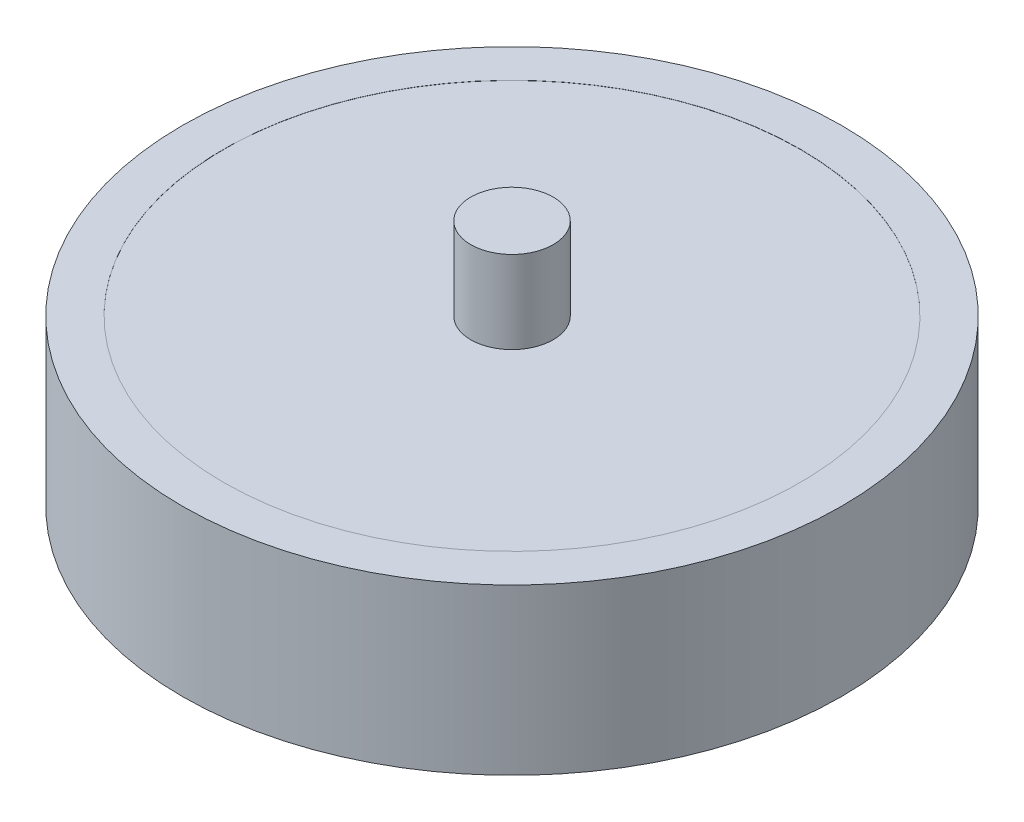
ISO-10303-21;
HEADER;
FILE_DESCRIPTION(('STEP AP214'),'2;1');
FILE_NAME('part.step','',(''),(''),'','','');
FILE_SCHEMA(('AUTOMOTIVE_DESIGN { 1 0 10303 214 1 1 1 1 }'));
ENDSEC;
DATA;
#1=APPLICATION_CONTEXT('core data for automotive mechanical design processes');
#2=APPLICATION_PROTOCOL_DEFINITION('international standard','automotive_design',2000,#1);
#3=PRODUCT_CONTEXT('',#1,'mechanical');
#4=PRODUCT('Part','Part','',(#3));
#5=PRODUCT_RELATED_PRODUCT_CATEGORY('part','',(#4));
#6=PRODUCT_DEFINITION_FORMATION('','',#4);
#7=PRODUCT_DEFINITION_CONTEXT('part definition',#1,'design');
#8=PRODUCT_DEFINITION('design','',#6,#7);
#9=PRODUCT_DEFINITION_SHAPE('','',#8);
#10=(LENGTH_UNIT() NAMED_UNIT(*) SI_UNIT(.MILLI.,.METRE.));
#11=(NAMED_UNIT(*) PLANE_ANGLE_UNIT() SI_UNIT($,.RADIAN.));
#12=(NAMED_UNIT(*) SI_UNIT($,.STERADIAN.) SOLID_ANGLE_UNIT());
#13=UNCERTAINTY_MEASURE_WITH_UNIT(LENGTH_MEASURE(1.E-05),#10,'distance_accuracy_value','');
#14=(GEOMETRIC_REPRESENTATION_CONTEXT(3) GLOBAL_UNCERTAINTY_ASSIGNED_CONTEXT((#13)) GLOBAL_UNIT_ASSIGNED_CONTEXT((#10,
#11,#12)) REPRESENTATION_CONTEXT('',''));
#15=CARTESIAN_POINT('',(0.,0.,0.));
#16=DIRECTION('',(0.,0.,1.));
#17=DIRECTION('',(1.,0.,0.));
#18=AXIS2_PLACEMENT_3D('',#15,#16,#17);
#19=CARTESIAN_POINT('',(0.,10.,0.));
#20=DIRECTION('',(0.,1.,0.));
#21=DIRECTION('',(0.,0.,1.));
#22=AXIS2_PLACEMENT_3D('',#19,#20,#21);
#23=PLANE('',#22);
#24=CARTESIAN_POINT('',(0.,10.,0.));
#25=DIRECTION('',(0.,1.,0.));
#26=DIRECTION('',(0.,0.,1.));
#27=AXIS2_PLACEMENT_3D('',#24,#25,#26);
#28=CIRCLE('',#27,20.);
#29=CARTESIAN_POINT('',(0.,10.,20.));
#30=VERTEX_POINT('',#29);
#31=EDGE_CURVE('E38',#30,#30,#28,.T.);
#32=ORIENTED_EDGE('',*,*,#31,.T.);
#33=EDGE_LOOP('',(#32));
#34=FACE_BOUND('',#33,.T.);
#35=CARTESIAN_POINT('',(0.,10.,0.));
#36=DIRECTION('',(0.,1.,0.));
#37=DIRECTION('',(0.,0.,1.));
#38=AXIS2_PLACEMENT_3D('',#35,#36,#37);
#39=CIRCLE('',#38,17.5);
#40=CARTESIAN_POINT('',(0.,10.,17.5));
#41=VERTEX_POINT('',#40);
#42=EDGE_CURVE('E47',#41,#41,#39,.T.);
#43=ORIENTED_EDGE('',*,*,#42,.F.);
#44=EDGE_LOOP('',(#43));
#45=FACE_BOUND('',#44,.T.);
#46=ADVANCED_FACE('F31',(#34,#45),#23,.T.);
#47=CARTESIAN_POINT('',(0.,0.,0.));
#48=DIRECTION('',(0.,1.,0.));
#49=DIRECTION('',(0.,0.,1.));
#50=AXIS2_PLACEMENT_3D('',#47,#48,#49);
#51=PLANE('',#50);
#52=CARTESIAN_POINT('',(0.,0.,0.));
#53=DIRECTION('',(0.,-1.,0.));
#54=DIRECTION('',(0.,0.,-1.));
#55=AXIS2_PLACEMENT_3D('',#52,#53,#54);
#56=CIRCLE('',#55,2.5);
#57=CARTESIAN_POINT('',(0.,0.,-2.5));
#58=VERTEX_POINT('',#57);
#59=EDGE_CURVE('E58',#58,#58,#56,.T.);
#60=ORIENTED_EDGE('',*,*,#59,.F.);
#61=EDGE_LOOP('',(#60));
#62=FACE_BOUND('',#61,.T.);
#63=CARTESIAN_POINT('',(0.,0.,0.));
#64=DIRECTION('',(0.,1.,0.));
#65=DIRECTION('',(0.,0.,1.));
#66=AXIS2_PLACEMENT_3D('',#63,#64,#65);
#67=CIRCLE('',#66,20.);
#68=CARTESIAN_POINT('',(0.,0.,20.));
#69=VERTEX_POINT('',#68);
#70=EDGE_CURVE('E42',#69,#69,#67,.T.);
#71=ORIENTED_EDGE('',*,*,#70,.F.);
#72=EDGE_LOOP('',(#71));
#73=FACE_BOUND('',#72,.T.);
#74=ADVANCED_FACE('F73',(#62,#73),#51,.F.);
#75=CARTESIAN_POINT('',(0.,10.,0.));
#76=DIRECTION('',(0.,-1.,0.));
#77=DIRECTION('',(0.,0.,-1.));
#78=AXIS2_PLACEMENT_3D('',#75,#76,#77);
#79=CYLINDRICAL_SURFACE('',#78,20.);
#80=ORIENTED_EDGE('',*,*,#31,.F.);
#81=EDGE_LOOP('',(#80));
#82=FACE_BOUND('',#81,.T.);
#83=ORIENTED_EDGE('',*,*,#70,.T.);
#84=EDGE_LOOP('',(#83));
#85=FACE_BOUND('',#84,.T.);
#86=ADVANCED_FACE('F33',(#82,#85),#79,.T.);
#87=CARTESIAN_POINT('',(0.,10.,0.));
#88=DIRECTION('',(0.,-1.,0.));
#89=DIRECTION('',(0.,0.,-1.));
#90=AXIS2_PLACEMENT_3D('',#87,#88,#89);
#91=CYLINDRICAL_SURFACE('',#90,17.5);
#92=CARTESIAN_POINT('',(0.,9.99,0.));
#93=DIRECTION('',(0.,1.,0.));
#94=DIRECTION('',(0.,0.,1.));
#95=AXIS2_PLACEMENT_3D('',#92,#93,#94);
#96=CIRCLE('',#95,17.5);
#97=CARTESIAN_POINT('',(0.,9.99,17.5));
#98=VERTEX_POINT('',#97);
#99=EDGE_CURVE('E10',#98,#98,#96,.T.);
#100=ORIENTED_EDGE('',*,*,#99,.F.);
#101=EDGE_LOOP('',(#100));
#102=FACE_BOUND('',#101,.T.);
#103=ORIENTED_EDGE('',*,*,#42,.T.);
#104=EDGE_LOOP('',(#103));
#105=FACE_BOUND('',#104,.T.);
#106=ADVANCED_FACE('F79',(#102,#105),#91,.F.);
#107=CARTESIAN_POINT('',(0.,9.99,0.));
#108=DIRECTION('',(0.,1.,0.));
#109=DIRECTION('',(0.,0.,1.));
#110=AXIS2_PLACEMENT_3D('',#107,#108,#109);
#111=PLANE('',#110);
#112=CARTESIAN_POINT('',(0.,9.99,0.));
#113=DIRECTION('',(0.,1.,0.));
#114=DIRECTION('',(0.,0.,1.));
#115=AXIS2_PLACEMENT_3D('',#112,#113,#114);
#116=CIRCLE('',#115,2.5);
#117=CARTESIAN_POINT('',(0.,9.99,2.5));
#118=VERTEX_POINT('',#117);
#119=EDGE_CURVE('E52',#118,#118,#116,.T.);
#120=ORIENTED_EDGE('',*,*,#119,.F.);
#121=EDGE_LOOP('',(#120));
#122=FACE_BOUND('',#121,.T.);
#123=ORIENTED_EDGE('',*,*,#99,.T.);
#124=EDGE_LOOP('',(#123));
#125=FACE_BOUND('',#124,.T.);
#126=ADVANCED_FACE('F84',(#122,#125),#111,.T.);
#127=CARTESIAN_POINT('',(0.,14.99,0.));
#128=DIRECTION('',(0.,-1.,0.));
#129=DIRECTION('',(0.,0.,-1.));
#130=AXIS2_PLACEMENT_3D('',#127,#128,#129);
#131=CYLINDRICAL_SURFACE('',#130,2.5);
#132=CARTESIAN_POINT('',(0.,14.99,0.));
#133=DIRECTION('',(0.,1.,0.));
#134=DIRECTION('',(0.,0.,1.));
#135=AXIS2_PLACEMENT_3D('',#132,#133,#134);
#136=CIRCLE('',#135,2.5);
#137=CARTESIAN_POINT('',(0.,14.99,2.5));
#138=VERTEX_POINT('',#137);
#139=EDGE_CURVE('E51',#138,#138,#136,.T.);
#140=ORIENTED_EDGE('',*,*,#139,.F.);
#141=EDGE_LOOP('',(#140));
#142=FACE_BOUND('',#141,.T.);
#143=ORIENTED_EDGE('',*,*,#119,.T.);
#144=EDGE_LOOP('',(#143));
#145=FACE_BOUND('',#144,.T.);
#146=ADVANCED_FACE('F95',(#142,#145),#131,.T.);
#147=CARTESIAN_POINT('',(0.,14.99,0.));
#148=DIRECTION('',(0.,1.,0.));
#149=DIRECTION('',(0.,0.,1.));
#150=AXIS2_PLACEMENT_3D('',#147,#148,#149);
#151=PLANE('',#150);
#152=ORIENTED_EDGE('',*,*,#139,.T.);
#153=EDGE_LOOP('',(#152));
#154=FACE_BOUND('',#153,.T.);
#155=ADVANCED_FACE('F69',(#154),#151,.T.);
#156=CARTESIAN_POINT('',(0.,5.,0.));
#157=DIRECTION('',(0.,-1.,0.));
#158=DIRECTION('',(0.,0.,-1.));
#159=AXIS2_PLACEMENT_3D('',#156,#157,#158);
#160=CYLINDRICAL_SURFACE('',#159,2.5);
#161=CARTESIAN_POINT('',(0.,5.,0.));
#162=DIRECTION('',(0.,-1.,0.));
#163=DIRECTION('',(0.,0.,-1.));
#164=AXIS2_PLACEMENT_3D('',#161,#162,#163);
#165=CIRCLE('',#164,2.5);
#166=CARTESIAN_POINT('',(0.,5.,-2.5));
#167=VERTEX_POINT('',#166);
#168=EDGE_CURVE('E55',#167,#167,#165,.T.);
#169=ORIENTED_EDGE('',*,*,#168,.F.);
#170=EDGE_LOOP('',(#169));
#171=FACE_BOUND('',#170,.T.);
#172=ORIENTED_EDGE('',*,*,#59,.T.);
#173=EDGE_LOOP('',(#172));
#174=FACE_BOUND('',#173,.T.);
#175=ADVANCED_FACE('F66',(#171,#174),#160,.F.);
#176=CARTESIAN_POINT('',(0.,5.,0.));
#177=DIRECTION('',(0.,-1.,0.));
#178=DIRECTION('',(0.,0.,-1.));
#179=AXIS2_PLACEMENT_3D('',#176,#177,#178);
#180=PLANE('',#179);
#181=ORIENTED_EDGE('',*,*,#168,.T.);
#182=EDGE_LOOP('',(#181));
#183=FACE_BOUND('',#182,.T.);
#184=ADVANCED_FACE('F64',(#183),#180,.T.);
#185=CLOSED_SHELL('',(#46,#74,#86,#106,#126,#146,#155,#175,#184));
#186=MANIFOLD_SOLID_BREP('B2',#185);
#187=ADVANCED_BREP_SHAPE_REPRESENTATION('',(#18,#186),#14);
#188=SHAPE_DEFINITION_REPRESENTATION(#9,#187);
ENDSEC;
END-ISO-10303-21;
